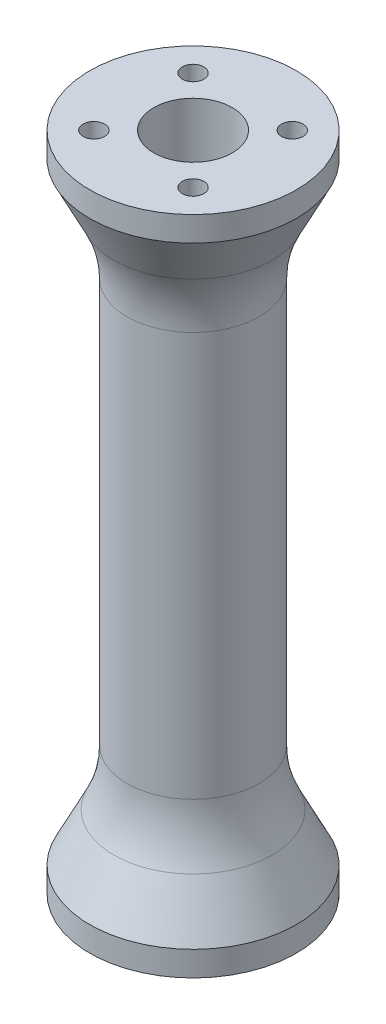
ISO-10303-21;
HEADER;
FILE_DESCRIPTION(('STEP AP214'),'2;1');
FILE_NAME('part.step','',(''),(''),'','','');
FILE_SCHEMA(('AUTOMOTIVE_DESIGN { 1 0 10303 214 1 1 1 1 }'));
ENDSEC;
DATA;
#1=APPLICATION_CONTEXT('core data for automotive mechanical design processes');
#2=APPLICATION_PROTOCOL_DEFINITION('international standard','automotive_design',2000,#1);
#3=PRODUCT_CONTEXT('',#1,'mechanical');
#4=PRODUCT('Part','Part','',(#3));
#5=PRODUCT_RELATED_PRODUCT_CATEGORY('part','',(#4));
#6=PRODUCT_DEFINITION_FORMATION('','',#4);
#7=PRODUCT_DEFINITION_CONTEXT('part definition',#1,'design');
#8=PRODUCT_DEFINITION('design','',#6,#7);
#9=PRODUCT_DEFINITION_SHAPE('','',#8);
#10=(LENGTH_UNIT() NAMED_UNIT(*) SI_UNIT(.MILLI.,.METRE.));
#11=(NAMED_UNIT(*) PLANE_ANGLE_UNIT() SI_UNIT($,.RADIAN.));
#12=(NAMED_UNIT(*) SI_UNIT($,.STERADIAN.) SOLID_ANGLE_UNIT());
#13=UNCERTAINTY_MEASURE_WITH_UNIT(LENGTH_MEASURE(1.E-05),#10,'distance_accuracy_value','');
#14=(GEOMETRIC_REPRESENTATION_CONTEXT(3) GLOBAL_UNCERTAINTY_ASSIGNED_CONTEXT((#13)) GLOBAL_UNIT_ASSIGNED_CONTEXT((#10,
#11,#12)) REPRESENTATION_CONTEXT('',''));
#15=CARTESIAN_POINT('',(0.,0.,0.));
#16=DIRECTION('',(0.,0.,1.));
#17=DIRECTION('',(1.,0.,0.));
#18=AXIS2_PLACEMENT_3D('',#15,#16,#17);
#19=CARTESIAN_POINT('',(0.,40.,0.));
#20=DIRECTION('',(0.,-1.,0.));
#21=DIRECTION('',(0.,0.,-1.));
#22=AXIS2_PLACEMENT_3D('',#19,#20,#21);
#23=PLANE('',#22);
#24=CARTESIAN_POINT('',(0.,40.,0.));
#25=DIRECTION('',(0.,1.,0.));
#26=DIRECTION('',(0.,0.,1.));
#27=AXIS2_PLACEMENT_3D('',#24,#25,#26);
#28=CIRCLE('',#27,4.75);
#29=CARTESIAN_POINT('',(0.,40.,4.75));
#30=VERTEX_POINT('',#29);
#31=EDGE_CURVE('E140',#30,#30,#28,.T.);
#32=ORIENTED_EDGE('',*,*,#31,.F.);
#33=EDGE_LOOP('',(#32));
#34=FACE_BOUND('',#33,.T.);
#35=CARTESIAN_POINT('',(6.,40.,-6.));
#36=DIRECTION('',(0.,1.,0.));
#37=DIRECTION('',(0.,0.,1.));
#38=AXIS2_PLACEMENT_3D('',#35,#36,#37);
#39=CIRCLE('',#38,1.3);
#40=CARTESIAN_POINT('',(6.,40.,-4.7));
#41=VERTEX_POINT('',#40);
#42=EDGE_CURVE('E94',#41,#41,#39,.T.);
#43=ORIENTED_EDGE('',*,*,#42,.F.);
#44=EDGE_LOOP('',(#43));
#45=FACE_BOUND('',#44,.T.);
#46=CARTESIAN_POINT('',(-6.,40.,6.));
#47=DIRECTION('',(0.,1.,0.));
#48=DIRECTION('',(0.,0.,1.));
#49=AXIS2_PLACEMENT_3D('',#46,#47,#48);
#50=CIRCLE('',#49,1.3);
#51=CARTESIAN_POINT('',(-6.,40.,7.3));
#52=VERTEX_POINT('',#51);
#53=EDGE_CURVE('E100',#52,#52,#50,.T.);
#54=ORIENTED_EDGE('',*,*,#53,.F.);
#55=EDGE_LOOP('',(#54));
#56=FACE_BOUND('',#55,.T.);
#57=CARTESIAN_POINT('',(6.,40.,6.));
#58=DIRECTION('',(0.,1.,0.));
#59=DIRECTION('',(0.,0.,1.));
#60=AXIS2_PLACEMENT_3D('',#57,#58,#59);
#61=CIRCLE('',#60,1.3);
#62=CARTESIAN_POINT('',(6.,40.,7.3));
#63=VERTEX_POINT('',#62);
#64=EDGE_CURVE('E101',#63,#63,#61,.T.);
#65=ORIENTED_EDGE('',*,*,#64,.F.);
#66=EDGE_LOOP('',(#65));
#67=FACE_BOUND('',#66,.T.);
#68=CARTESIAN_POINT('',(-6.,40.,-6.));
#69=DIRECTION('',(0.,1.,0.));
#70=DIRECTION('',(0.,0.,1.));
#71=AXIS2_PLACEMENT_3D('',#68,#69,#70);
#72=CIRCLE('',#71,1.3);
#73=CARTESIAN_POINT('',(-6.,40.,-4.7));
#74=VERTEX_POINT('',#73);
#75=EDGE_CURVE('E91',#74,#74,#72,.T.);
#76=ORIENTED_EDGE('',*,*,#75,.F.);
#77=EDGE_LOOP('',(#76));
#78=FACE_BOUND('',#77,.T.);
#79=CARTESIAN_POINT('',(0.,40.,0.));
#80=DIRECTION('',(0.,-1.,0.));
#81=DIRECTION('',(0.,0.,-1.));
#82=AXIS2_PLACEMENT_3D('',#79,#80,#81);
#83=CIRCLE('',#82,12.5);
#84=CARTESIAN_POINT('',(0.,40.,-12.5));
#85=VERTEX_POINT('',#84);
#86=EDGE_CURVE('E73',#85,#85,#83,.T.);
#87=ORIENTED_EDGE('',*,*,#86,.F.);
#88=EDGE_LOOP('',(#87));
#89=FACE_BOUND('',#88,.T.);
#90=ADVANCED_FACE('F41',(#34,#45,#56,#67,#78,#89),#23,.F.);
#91=CARTESIAN_POINT('',(0.,-40.,0.));
#92=DIRECTION('',(0.,-1.,0.));
#93=DIRECTION('',(0.,0.,-1.));
#94=AXIS2_PLACEMENT_3D('',#91,#92,#93);
#95=CYLINDRICAL_SURFACE('',#94,12.5);
#96=CARTESIAN_POINT('',(0.,37.,0.));
#97=DIRECTION('',(0.,-1.,0.));
#98=DIRECTION('',(0.,0.,-1.));
#99=AXIS2_PLACEMENT_3D('',#96,#97,#98);
#100=CIRCLE('',#99,12.5);
#101=CARTESIAN_POINT('',(0.,37.,-12.5));
#102=VERTEX_POINT('',#101);
#103=EDGE_CURVE('E81',#102,#102,#100,.T.);
#104=ORIENTED_EDGE('',*,*,#103,.F.);
#105=EDGE_LOOP('',(#104));
#106=FACE_BOUND('',#105,.T.);
#107=ORIENTED_EDGE('',*,*,#86,.T.);
#108=EDGE_LOOP('',(#107));
#109=FACE_BOUND('',#108,.T.);
#110=ADVANCED_FACE('F174',(#106,#109),#95,.T.);
#111=CARTESIAN_POINT('',(0.,37.,0.));
#112=DIRECTION('',(0.,1.,0.));
#113=DIRECTION('',(0.,0.,1.));
#114=AXIS2_PLACEMENT_3D('',#111,#112,#113);
#115=CONICAL_SURFACE('',#114,12.5,0.463647609000807);
#116=CARTESIAN_POINT('',(0.,31.1671842700025,0.));
#117=DIRECTION('',(0.,1.,0.));
#118=DIRECTION('',(0.,0.,1.));
#119=AXIS2_PLACEMENT_3D('',#116,#117,#118);
#120=CIRCLE('',#119,9.58359213500126);
#121=CARTESIAN_POINT('',(0.,31.1671842700025,9.58359213500126));
#122=VERTEX_POINT('',#121);
#123=EDGE_CURVE('E61',#122,#122,#120,.T.);
#124=ORIENTED_EDGE('',*,*,#123,.T.);
#125=EDGE_LOOP('',(#124));
#126=FACE_BOUND('',#125,.T.);
#127=ORIENTED_EDGE('',*,*,#103,.T.);
#128=EDGE_LOOP('',(#127));
#129=FACE_BOUND('',#128,.T.);
#130=ADVANCED_FACE('F182',(#126,#129),#115,.T.);
#131=CARTESIAN_POINT('',(0.,-40.,0.));
#132=DIRECTION('',(0.,-1.,0.));
#133=DIRECTION('',(0.,0.,-1.));
#134=AXIS2_PLACEMENT_3D('',#131,#132,#133);
#135=CYLINDRICAL_SURFACE('',#134,7.99999999999999);
#136=CARTESIAN_POINT('',(0.,-24.4589803375031,0.));
#137=DIRECTION('',(0.,-1.,0.));
#138=DIRECTION('',(0.,0.,-1.));
#139=AXIS2_PLACEMENT_3D('',#136,#137,#138);
#140=CIRCLE('',#139,7.99999999999999);
#141=CARTESIAN_POINT('',(0.,-24.4589803375031,-7.99999999999999));
#142=VERTEX_POINT('',#141);
#143=EDGE_CURVE('E64',#142,#142,#140,.F.);
#144=ORIENTED_EDGE('',*,*,#143,.T.);
#145=EDGE_LOOP('',(#144));
#146=FACE_BOUND('',#145,.T.);
#147=CARTESIAN_POINT('',(0.,24.4589803375031,0.));
#148=DIRECTION('',(0.,-1.,0.));
#149=DIRECTION('',(0.,0.,-1.));
#150=AXIS2_PLACEMENT_3D('',#147,#148,#149);
#151=CIRCLE('',#150,7.99999999999999);
#152=CARTESIAN_POINT('',(0.,24.4589803375031,-7.99999999999999));
#153=VERTEX_POINT('',#152);
#154=EDGE_CURVE('E67',#153,#153,#151,.T.);
#155=ORIENTED_EDGE('',*,*,#154,.T.);
#156=EDGE_LOOP('',(#155));
#157=FACE_BOUND('',#156,.T.);
#158=ADVANCED_FACE('F281',(#146,#157),#135,.T.);
#159=CARTESIAN_POINT('',(0.,-28.,0.));
#160=DIRECTION('',(0.,-1.,0.));
#161=DIRECTION('',(0.,0.,-1.));
#162=AXIS2_PLACEMENT_3D('',#159,#160,#161);
#163=CONICAL_SURFACE('',#162,7.99999999999999,0.463647609000807);
#164=CARTESIAN_POINT('',(0.,-31.1671842700025,0.));
#165=DIRECTION('',(0.,-1.,0.));
#166=DIRECTION('',(0.,0.,-1.));
#167=AXIS2_PLACEMENT_3D('',#164,#165,#166);
#168=CIRCLE('',#167,9.58359213500126);
#169=CARTESIAN_POINT('',(0.,-31.1671842700025,-9.58359213500126));
#170=VERTEX_POINT('',#169);
#171=EDGE_CURVE('E70',#170,#170,#168,.T.);
#172=ORIENTED_EDGE('',*,*,#171,.T.);
#173=EDGE_LOOP('',(#172));
#174=FACE_BOUND('',#173,.T.);
#175=CARTESIAN_POINT('',(0.,-37.,0.));
#176=DIRECTION('',(0.,-1.,0.));
#177=DIRECTION('',(0.,0.,-1.));
#178=AXIS2_PLACEMENT_3D('',#175,#176,#177);
#179=CIRCLE('',#178,12.5);
#180=CARTESIAN_POINT('',(0.,-37.,-12.5));
#181=VERTEX_POINT('',#180);
#182=EDGE_CURVE('E84',#181,#181,#179,.T.);
#183=ORIENTED_EDGE('',*,*,#182,.F.);
#184=EDGE_LOOP('',(#183));
#185=FACE_BOUND('',#184,.T.);
#186=ADVANCED_FACE('F277',(#174,#185),#163,.T.);
#187=CARTESIAN_POINT('',(0.,-40.,0.));
#188=DIRECTION('',(0.,-1.,0.));
#189=DIRECTION('',(0.,0.,-1.));
#190=AXIS2_PLACEMENT_3D('',#187,#188,#189);
#191=CYLINDRICAL_SURFACE('',#190,12.5);
#192=CARTESIAN_POINT('',(0.,-40.,0.));
#193=DIRECTION('',(0.,-1.,0.));
#194=DIRECTION('',(0.,0.,-1.));
#195=AXIS2_PLACEMENT_3D('',#192,#193,#194);
#196=CIRCLE('',#195,12.5);
#197=CARTESIAN_POINT('',(0.,-40.,-12.5));
#198=VERTEX_POINT('',#197);
#199=EDGE_CURVE('E87',#198,#198,#196,.T.);
#200=ORIENTED_EDGE('',*,*,#199,.F.);
#201=EDGE_LOOP('',(#200));
#202=FACE_BOUND('',#201,.T.);
#203=ORIENTED_EDGE('',*,*,#182,.T.);
#204=EDGE_LOOP('',(#203));
#205=FACE_BOUND('',#204,.T.);
#206=ADVANCED_FACE('F274',(#202,#205),#191,.T.);
#207=CARTESIAN_POINT('',(0.,-40.,0.));
#208=DIRECTION('',(0.,1.,0.));
#209=DIRECTION('',(0.,0.,1.));
#210=AXIS2_PLACEMENT_3D('',#207,#208,#209);
#211=PLANE('',#210);
#212=CARTESIAN_POINT('',(0.,-40.,0.));
#213=DIRECTION('',(0.,1.,0.));
#214=DIRECTION('',(0.,0.,1.));
#215=AXIS2_PLACEMENT_3D('',#212,#213,#214);
#216=CIRCLE('',#215,4.75);
#217=CARTESIAN_POINT('',(0.,-40.,4.75));
#218=VERTEX_POINT('',#217);
#219=EDGE_CURVE('E78',#218,#218,#216,.T.);
#220=ORIENTED_EDGE('',*,*,#219,.T.);
#221=EDGE_LOOP('',(#220));
#222=FACE_BOUND('',#221,.T.);
#223=CARTESIAN_POINT('',(6.,-40.,-6.));
#224=DIRECTION('',(0.,1.,0.));
#225=DIRECTION('',(0.,0.,1.));
#226=AXIS2_PLACEMENT_3D('',#223,#224,#225);
#227=CIRCLE('',#226,1.3);
#228=CARTESIAN_POINT('',(6.,-40.,-4.7));
#229=VERTEX_POINT('',#228);
#230=EDGE_CURVE('E128',#229,#229,#227,.T.);
#231=ORIENTED_EDGE('',*,*,#230,.T.);
#232=EDGE_LOOP('',(#231));
#233=FACE_BOUND('',#232,.T.);
#234=CARTESIAN_POINT('',(-6.,-40.,6.));
#235=DIRECTION('',(0.,1.,0.));
#236=DIRECTION('',(0.,0.,1.));
#237=AXIS2_PLACEMENT_3D('',#234,#235,#236);
#238=CIRCLE('',#237,1.3);
#239=CARTESIAN_POINT('',(-6.,-40.,7.3));
#240=VERTEX_POINT('',#239);
#241=EDGE_CURVE('E121',#240,#240,#238,.T.);
#242=ORIENTED_EDGE('',*,*,#241,.T.);
#243=EDGE_LOOP('',(#242));
#244=FACE_BOUND('',#243,.T.);
#245=CARTESIAN_POINT('',(6.,-40.,6.));
#246=DIRECTION('',(0.,1.,0.));
#247=DIRECTION('',(0.,0.,1.));
#248=AXIS2_PLACEMENT_3D('',#245,#246,#247);
#249=CIRCLE('',#248,1.3);
#250=CARTESIAN_POINT('',(6.,-40.,7.3));
#251=VERTEX_POINT('',#250);
#252=EDGE_CURVE('E133',#251,#251,#249,.T.);
#253=ORIENTED_EDGE('',*,*,#252,.T.);
#254=EDGE_LOOP('',(#253));
#255=FACE_BOUND('',#254,.T.);
#256=CARTESIAN_POINT('',(-6.,-40.,-6.));
#257=DIRECTION('',(0.,1.,0.));
#258=DIRECTION('',(0.,0.,1.));
#259=AXIS2_PLACEMENT_3D('',#256,#257,#258);
#260=CIRCLE('',#259,1.3);
#261=CARTESIAN_POINT('',(-6.,-40.,-4.7));
#262=VERTEX_POINT('',#261);
#263=EDGE_CURVE('E115',#262,#262,#260,.T.);
#264=ORIENTED_EDGE('',*,*,#263,.T.);
#265=EDGE_LOOP('',(#264));
#266=FACE_BOUND('',#265,.T.);
#267=ORIENTED_EDGE('',*,*,#199,.T.);
#268=EDGE_LOOP('',(#267));
#269=FACE_BOUND('',#268,.T.);
#270=ADVANCED_FACE('F146',(#222,#233,#244,#255,#266,#269),#211,.F.);
#271=CARTESIAN_POINT('',(-6.,33.,-6.));
#272=DIRECTION('',(0.,1.,0.));
#273=DIRECTION('',(0.,0.,1.));
#274=AXIS2_PLACEMENT_3D('',#271,#272,#273);
#275=CYLINDRICAL_SURFACE('',#274,1.3);
#276=CARTESIAN_POINT('',(-6.,33.,-6.));
#277=DIRECTION('',(0.,1.,0.));
#278=DIRECTION('',(0.,0.,1.));
#279=AXIS2_PLACEMENT_3D('',#276,#277,#278);
#280=CIRCLE('',#279,1.3);
#281=CARTESIAN_POINT('',(-6.,33.,-4.7));
#282=VERTEX_POINT('',#281);
#283=EDGE_CURVE('E90',#282,#282,#280,.T.);
#284=ORIENTED_EDGE('',*,*,#283,.F.);
#285=EDGE_LOOP('',(#284));
#286=FACE_BOUND('',#285,.T.);
#287=ORIENTED_EDGE('',*,*,#75,.T.);
#288=EDGE_LOOP('',(#287));
#289=FACE_BOUND('',#288,.T.);
#290=ADVANCED_FACE('F268',(#286,#289),#275,.F.);
#291=CARTESIAN_POINT('',(-6.,33.,-6.));
#292=DIRECTION('',(0.,1.,0.));
#293=DIRECTION('',(0.,0.,1.));
#294=AXIS2_PLACEMENT_3D('',#291,#292,#293);
#295=PLANE('',#294);
#296=ORIENTED_EDGE('',*,*,#283,.T.);
#297=EDGE_LOOP('',(#296));
#298=FACE_BOUND('',#297,.T.);
#299=ADVANCED_FACE('F246',(#298),#295,.T.);
#300=CARTESIAN_POINT('',(6.,33.,6.));
#301=DIRECTION('',(0.,1.,0.));
#302=DIRECTION('',(0.,0.,1.));
#303=AXIS2_PLACEMENT_3D('',#300,#301,#302);
#304=CYLINDRICAL_SURFACE('',#303,1.3);
#305=CARTESIAN_POINT('',(6.,33.,6.));
#306=DIRECTION('',(0.,1.,0.));
#307=DIRECTION('',(0.,0.,1.));
#308=AXIS2_PLACEMENT_3D('',#305,#306,#307);
#309=CIRCLE('',#308,1.3);
#310=CARTESIAN_POINT('',(6.,33.,7.3));
#311=VERTEX_POINT('',#310);
#312=EDGE_CURVE('E109',#311,#311,#309,.T.);
#313=ORIENTED_EDGE('',*,*,#312,.F.);
#314=EDGE_LOOP('',(#313));
#315=FACE_BOUND('',#314,.T.);
#316=ORIENTED_EDGE('',*,*,#64,.T.);
#317=EDGE_LOOP('',(#316));
#318=FACE_BOUND('',#317,.T.);
#319=ADVANCED_FACE('F242',(#315,#318),#304,.F.);
#320=CARTESIAN_POINT('',(6.,33.,6.));
#321=DIRECTION('',(0.,1.,0.));
#322=DIRECTION('',(0.,0.,1.));
#323=AXIS2_PLACEMENT_3D('',#320,#321,#322);
#324=PLANE('',#323);
#325=ORIENTED_EDGE('',*,*,#312,.T.);
#326=EDGE_LOOP('',(#325));
#327=FACE_BOUND('',#326,.T.);
#328=ADVANCED_FACE('F245',(#327),#324,.T.);
#329=CARTESIAN_POINT('',(-6.,33.,6.));
#330=DIRECTION('',(0.,1.,0.));
#331=DIRECTION('',(0.,0.,1.));
#332=AXIS2_PLACEMENT_3D('',#329,#330,#331);
#333=CYLINDRICAL_SURFACE('',#332,1.3);
#334=CARTESIAN_POINT('',(-6.,33.,6.));
#335=DIRECTION('',(0.,1.,0.));
#336=DIRECTION('',(0.,0.,1.));
#337=AXIS2_PLACEMENT_3D('',#334,#335,#336);
#338=CIRCLE('',#337,1.3);
#339=CARTESIAN_POINT('',(-6.,33.,7.3));
#340=VERTEX_POINT('',#339);
#341=EDGE_CURVE('E97',#340,#340,#338,.T.);
#342=ORIENTED_EDGE('',*,*,#341,.F.);
#343=EDGE_LOOP('',(#342));
#344=FACE_BOUND('',#343,.T.);
#345=ORIENTED_EDGE('',*,*,#53,.T.);
#346=EDGE_LOOP('',(#345));
#347=FACE_BOUND('',#346,.T.);
#348=ADVANCED_FACE('F250',(#344,#347),#333,.F.);
#349=CARTESIAN_POINT('',(-6.,33.,6.));
#350=DIRECTION('',(0.,1.,0.));
#351=DIRECTION('',(0.,0.,1.));
#352=AXIS2_PLACEMENT_3D('',#349,#350,#351);
#353=PLANE('',#352);
#354=ORIENTED_EDGE('',*,*,#341,.T.);
#355=EDGE_LOOP('',(#354));
#356=FACE_BOUND('',#355,.T.);
#357=ADVANCED_FACE('F255',(#356),#353,.T.);
#358=CARTESIAN_POINT('',(6.,33.,-6.));
#359=DIRECTION('',(0.,1.,0.));
#360=DIRECTION('',(0.,0.,1.));
#361=AXIS2_PLACEMENT_3D('',#358,#359,#360);
#362=CYLINDRICAL_SURFACE('',#361,1.3);
#363=CARTESIAN_POINT('',(6.,33.,-6.));
#364=DIRECTION('',(0.,1.,0.));
#365=DIRECTION('',(0.,0.,1.));
#366=AXIS2_PLACEMENT_3D('',#363,#364,#365);
#367=CIRCLE('',#366,1.3);
#368=CARTESIAN_POINT('',(6.,33.,-4.7));
#369=VERTEX_POINT('',#368);
#370=EDGE_CURVE('E104',#369,#369,#367,.T.);
#371=ORIENTED_EDGE('',*,*,#370,.F.);
#372=EDGE_LOOP('',(#371));
#373=FACE_BOUND('',#372,.T.);
#374=ORIENTED_EDGE('',*,*,#42,.T.);
#375=EDGE_LOOP('',(#374));
#376=FACE_BOUND('',#375,.T.);
#377=ADVANCED_FACE('F252',(#373,#376),#362,.F.);
#378=CARTESIAN_POINT('',(6.,33.,-6.));
#379=DIRECTION('',(0.,1.,0.));
#380=DIRECTION('',(0.,0.,1.));
#381=AXIS2_PLACEMENT_3D('',#378,#379,#380);
#382=PLANE('',#381);
#383=ORIENTED_EDGE('',*,*,#370,.T.);
#384=EDGE_LOOP('',(#383));
#385=FACE_BOUND('',#384,.T.);
#386=ADVANCED_FACE('F240',(#385),#382,.T.);
#387=CARTESIAN_POINT('',(-6.,-33.,-6.));
#388=DIRECTION('',(0.,-1.,0.));
#389=DIRECTION('',(0.,0.,-1.));
#390=AXIS2_PLACEMENT_3D('',#387,#388,#389);
#391=CYLINDRICAL_SURFACE('',#390,1.3);
#392=CARTESIAN_POINT('',(-6.,-33.,-6.));
#393=DIRECTION('',(0.,1.,0.));
#394=DIRECTION('',(0.,0.,1.));
#395=AXIS2_PLACEMENT_3D('',#392,#393,#394);
#396=CIRCLE('',#395,1.3);
#397=CARTESIAN_POINT('',(-6.,-33.,-4.7));
#398=VERTEX_POINT('',#397);
#399=EDGE_CURVE('E112',#398,#398,#396,.T.);
#400=ORIENTED_EDGE('',*,*,#399,.T.);
#401=EDGE_LOOP('',(#400));
#402=FACE_BOUND('',#401,.T.);
#403=ORIENTED_EDGE('',*,*,#263,.F.);
#404=EDGE_LOOP('',(#403));
#405=FACE_BOUND('',#404,.T.);
#406=ADVANCED_FACE('F236',(#402,#405),#391,.F.);
#407=CARTESIAN_POINT('',(-6.,-33.,-6.));
#408=DIRECTION('',(0.,-1.,0.));
#409=DIRECTION('',(0.,0.,1.));
#410=AXIS2_PLACEMENT_3D('',#407,#408,#409);
#411=PLANE('',#410);
#412=ORIENTED_EDGE('',*,*,#399,.F.);
#413=EDGE_LOOP('',(#412));
#414=FACE_BOUND('',#413,.T.);
#415=ADVANCED_FACE('F219',(#414),#411,.T.);
#416=CARTESIAN_POINT('',(6.,-33.,6.));
#417=DIRECTION('',(0.,-1.,0.));
#418=DIRECTION('',(0.,0.,-1.));
#419=AXIS2_PLACEMENT_3D('',#416,#417,#418);
#420=CYLINDRICAL_SURFACE('',#419,1.3);
#421=CARTESIAN_POINT('',(6.,-33.,6.));
#422=DIRECTION('',(0.,1.,0.));
#423=DIRECTION('',(0.,0.,1.));
#424=AXIS2_PLACEMENT_3D('',#421,#422,#423);
#425=CIRCLE('',#424,1.3);
#426=CARTESIAN_POINT('',(6.,-33.,7.3));
#427=VERTEX_POINT('',#426);
#428=EDGE_CURVE('E125',#427,#427,#425,.T.);
#429=ORIENTED_EDGE('',*,*,#428,.T.);
#430=EDGE_LOOP('',(#429));
#431=FACE_BOUND('',#430,.T.);
#432=ORIENTED_EDGE('',*,*,#252,.F.);
#433=EDGE_LOOP('',(#432));
#434=FACE_BOUND('',#433,.T.);
#435=ADVANCED_FACE('F215',(#431,#434),#420,.F.);
#436=CARTESIAN_POINT('',(6.,-33.,6.));
#437=DIRECTION('',(0.,-1.,0.));
#438=DIRECTION('',(0.,0.,1.));
#439=AXIS2_PLACEMENT_3D('',#436,#437,#438);
#440=PLANE('',#439);
#441=ORIENTED_EDGE('',*,*,#428,.F.);
#442=EDGE_LOOP('',(#441));
#443=FACE_BOUND('',#442,.T.);
#444=ADVANCED_FACE('F211',(#443),#440,.T.);
#445=CARTESIAN_POINT('',(-6.,-33.,6.));
#446=DIRECTION('',(0.,-1.,0.));
#447=DIRECTION('',(0.,0.,-1.));
#448=AXIS2_PLACEMENT_3D('',#445,#446,#447);
#449=CYLINDRICAL_SURFACE('',#448,1.3);
#450=CARTESIAN_POINT('',(-6.,-33.,6.));
#451=DIRECTION('',(0.,1.,0.));
#452=DIRECTION('',(0.,0.,1.));
#453=AXIS2_PLACEMENT_3D('',#450,#451,#452);
#454=CIRCLE('',#453,1.3);
#455=CARTESIAN_POINT('',(-6.,-33.,7.3));
#456=VERTEX_POINT('',#455);
#457=EDGE_CURVE('E124',#456,#456,#454,.T.);
#458=ORIENTED_EDGE('',*,*,#457,.T.);
#459=EDGE_LOOP('',(#458));
#460=FACE_BOUND('',#459,.T.);
#461=ORIENTED_EDGE('',*,*,#241,.F.);
#462=EDGE_LOOP('',(#461));
#463=FACE_BOUND('',#462,.T.);
#464=ADVANCED_FACE('F214',(#460,#463),#449,.F.);
#465=CARTESIAN_POINT('',(-6.,-33.,6.));
#466=DIRECTION('',(0.,-1.,0.));
#467=DIRECTION('',(0.,0.,1.));
#468=AXIS2_PLACEMENT_3D('',#465,#466,#467);
#469=PLANE('',#468);
#470=ORIENTED_EDGE('',*,*,#457,.F.);
#471=EDGE_LOOP('',(#470));
#472=FACE_BOUND('',#471,.T.);
#473=ADVANCED_FACE('F226',(#472),#469,.T.);
#474=CARTESIAN_POINT('',(6.,-33.,-6.));
#475=DIRECTION('',(0.,-1.,0.));
#476=DIRECTION('',(0.,0.,-1.));
#477=AXIS2_PLACEMENT_3D('',#474,#475,#476);
#478=CYLINDRICAL_SURFACE('',#477,1.3);
#479=CARTESIAN_POINT('',(6.,-33.,-6.));
#480=DIRECTION('',(0.,1.,0.));
#481=DIRECTION('',(0.,0.,1.));
#482=AXIS2_PLACEMENT_3D('',#479,#480,#481);
#483=CIRCLE('',#482,1.3);
#484=CARTESIAN_POINT('',(6.,-33.,-4.7));
#485=VERTEX_POINT('',#484);
#486=EDGE_CURVE('E118',#485,#485,#483,.T.);
#487=ORIENTED_EDGE('',*,*,#486,.T.);
#488=EDGE_LOOP('',(#487));
#489=FACE_BOUND('',#488,.T.);
#490=ORIENTED_EDGE('',*,*,#230,.F.);
#491=EDGE_LOOP('',(#490));
#492=FACE_BOUND('',#491,.T.);
#493=ADVANCED_FACE('F222',(#489,#492),#478,.F.);
#494=CARTESIAN_POINT('',(6.,-33.,-6.));
#495=DIRECTION('',(0.,-1.,0.));
#496=DIRECTION('',(0.,0.,1.));
#497=AXIS2_PLACEMENT_3D('',#494,#495,#496);
#498=PLANE('',#497);
#499=ORIENTED_EDGE('',*,*,#486,.F.);
#500=EDGE_LOOP('',(#499));
#501=FACE_BOUND('',#500,.T.);
#502=ADVANCED_FACE('F153',(#501),#498,.T.);
#503=CARTESIAN_POINT('',(0.,-40.,0.));
#504=DIRECTION('',(0.,1.,0.));
#505=DIRECTION('',(0.,0.,1.));
#506=AXIS2_PLACEMENT_3D('',#503,#504,#505);
#507=CYLINDRICAL_SURFACE('',#506,4.75);
#508=ORIENTED_EDGE('',*,*,#219,.F.);
#509=EDGE_LOOP('',(#508));
#510=FACE_BOUND('',#509,.T.);
#511=CARTESIAN_POINT('',(0.,-31.95,0.));
#512=DIRECTION('',(0.,1.,0.));
#513=DIRECTION('',(0.,0.,1.));
#514=AXIS2_PLACEMENT_3D('',#511,#512,#513);
#515=CIRCLE('',#514,4.75);
#516=CARTESIAN_POINT('',(0.,-31.95,4.74999999999999));
#517=VERTEX_POINT('',#516);
#518=EDGE_CURVE('E74',#517,#517,#515,.F.);
#519=ORIENTED_EDGE('',*,*,#518,.F.);
#520=EDGE_LOOP('',(#519));
#521=FACE_BOUND('',#520,.T.);
#522=ADVANCED_FACE('F149',(#510,#521),#507,.F.);
#523=ORIENTED_EDGE('',*,*,#31,.T.);
#524=EDGE_LOOP('',(#523));
#525=FACE_BOUND('',#524,.T.);
#526=CARTESIAN_POINT('',(0.,31.95,0.));
#527=DIRECTION('',(0.,-1.,0.));
#528=DIRECTION('',(0.,0.,-1.));
#529=AXIS2_PLACEMENT_3D('',#526,#527,#528);
#530=CIRCLE('',#529,4.75);
#531=CARTESIAN_POINT('',(0.,31.95,-4.75));
#532=VERTEX_POINT('',#531);
#533=EDGE_CURVE('E77',#532,#532,#530,.F.);
#534=ORIENTED_EDGE('',*,*,#533,.F.);
#535=EDGE_LOOP('',(#534));
#536=FACE_BOUND('',#535,.T.);
#537=ADVANCED_FACE('F152',(#525,#536),#507,.F.);
#538=CARTESIAN_POINT('',(0.,36.6999999999999,0.));
#539=DIRECTION('',(0.,1.,0.));
#540=DIRECTION('',(0.,0.,1.));
#541=AXIS2_PLACEMENT_3D('',#538,#539,#540);
#542=CYLINDRICAL_SURFACE('',#541,7.);
#543=CARTESIAN_POINT('',(0.,-28.0431457505076,0.));
#544=DIRECTION('',(0.,1.,0.));
#545=DIRECTION('',(0.,0.,1.));
#546=AXIS2_PLACEMENT_3D('',#543,#544,#545);
#547=CIRCLE('',#546,7.);
#548=CARTESIAN_POINT('',(0.,-28.0431457505076,6.99999999999999));
#549=VERTEX_POINT('',#548);
#550=EDGE_CURVE('E48',#549,#549,#547,.F.);
#551=ORIENTED_EDGE('',*,*,#550,.T.);
#552=EDGE_LOOP('',(#551));
#553=FACE_BOUND('',#552,.T.);
#554=CARTESIAN_POINT('',(0.,28.0431457505076,0.));
#555=DIRECTION('',(0.,1.,0.));
#556=DIRECTION('',(0.,0.,1.));
#557=AXIS2_PLACEMENT_3D('',#554,#555,#556);
#558=CIRCLE('',#557,7.);
#559=CARTESIAN_POINT('',(0.,28.0431457505076,7.));
#560=VERTEX_POINT('',#559);
#561=EDGE_CURVE('E52',#560,#560,#558,.T.);
#562=ORIENTED_EDGE('',*,*,#561,.T.);
#563=EDGE_LOOP('',(#562));
#564=FACE_BOUND('',#563,.T.);
#565=ADVANCED_FACE('F171',(#553,#564),#542,.F.);
#566=CARTESIAN_POINT('',(0.,36.6999999999999,0.));
#567=DIRECTION('',(0.,-1.,0.));
#568=DIRECTION('',(0.,0.,-1.));
#569=AXIS2_PLACEMENT_3D('',#566,#567,#568);
#570=CONICAL_SURFACE('',#569,0.,0.785398163397454);
#571=CARTESIAN_POINT('',(0.,30.8715728752538,0.));
#572=DIRECTION('',(0.,-1.,0.));
#573=DIRECTION('',(0.,0.,-1.));
#574=AXIS2_PLACEMENT_3D('',#571,#572,#573);
#575=CIRCLE('',#574,5.82842712474618);
#576=CARTESIAN_POINT('',(0.,30.8715728752538,-5.82842712474618));
#577=VERTEX_POINT('',#576);
#578=EDGE_CURVE('E10',#577,#577,#575,.T.);
#579=ORIENTED_EDGE('',*,*,#578,.T.);
#580=EDGE_LOOP('',(#579));
#581=FACE_BOUND('',#580,.T.);
#582=ORIENTED_EDGE('',*,*,#533,.T.);
#583=EDGE_LOOP('',(#582));
#584=FACE_BOUND('',#583,.T.);
#585=ADVANCED_FACE('F160',(#581,#584),#570,.F.);
#586=CARTESIAN_POINT('',(0.,-29.7,0.));
#587=DIRECTION('',(0.,1.,0.));
#588=DIRECTION('',(0.,0.,1.));
#589=AXIS2_PLACEMENT_3D('',#586,#587,#588);
#590=CONICAL_SURFACE('',#589,7.,0.785398163397454);
#591=CARTESIAN_POINT('',(0.,-30.8715728752538,0.));
#592=DIRECTION('',(0.,1.,0.));
#593=DIRECTION('',(0.,0.,1.));
#594=AXIS2_PLACEMENT_3D('',#591,#592,#593);
#595=CIRCLE('',#594,5.82842712474617);
#596=CARTESIAN_POINT('',(0.,-30.8715728752538,5.82842712474616));
#597=VERTEX_POINT('',#596);
#598=EDGE_CURVE('E56',#597,#597,#595,.T.);
#599=ORIENTED_EDGE('',*,*,#598,.T.);
#600=EDGE_LOOP('',(#599));
#601=FACE_BOUND('',#600,.T.);
#602=ORIENTED_EDGE('',*,*,#518,.T.);
#603=EDGE_LOOP('',(#602));
#604=FACE_BOUND('',#603,.T.);
#605=ADVANCED_FACE('F157',(#601,#604),#590,.F.);
#606=CARTESIAN_POINT('',(0.,-24.4589803375031,0.));
#607=DIRECTION('',(0.,-1.,0.));
#608=DIRECTION('',(0.,0.,-1.));
#609=AXIS2_PLACEMENT_3D('',#606,#607,#608);
#610=TOROIDAL_SURFACE('',#609,23.,15.);
#611=ORIENTED_EDGE('',*,*,#143,.F.);
#612=EDGE_LOOP('',(#611));
#613=FACE_BOUND('',#612,.T.);
#614=ORIENTED_EDGE('',*,*,#171,.F.);
#615=EDGE_LOOP('',(#614));
#616=FACE_BOUND('',#615,.T.);
#617=ADVANCED_FACE('F159',(#613,#616),#610,.F.);
#618=CARTESIAN_POINT('',(0.,24.4589803375031,0.));
#619=DIRECTION('',(0.,-1.,0.));
#620=DIRECTION('',(0.,0.,-1.));
#621=AXIS2_PLACEMENT_3D('',#618,#619,#620);
#622=TOROIDAL_SURFACE('',#621,23.,15.);
#623=ORIENTED_EDGE('',*,*,#123,.F.);
#624=EDGE_LOOP('',(#623));
#625=FACE_BOUND('',#624,.T.);
#626=ORIENTED_EDGE('',*,*,#154,.F.);
#627=EDGE_LOOP('',(#626));
#628=FACE_BOUND('',#627,.T.);
#629=ADVANCED_FACE('F168',(#625,#628),#622,.F.);
#630=CARTESIAN_POINT('',(0.,-28.0431457505076,0.));
#631=DIRECTION('',(0.,1.,0.));
#632=DIRECTION('',(0.,0.,1.));
#633=AXIS2_PLACEMENT_3D('',#630,#631,#632);
#634=DEGENERATE_TOROIDAL_SURFACE('',#633,3.,4.,.T.);
#635=ORIENTED_EDGE('',*,*,#550,.F.);
#636=EDGE_LOOP('',(#635));
#637=FACE_BOUND('',#636,.T.);
#638=ORIENTED_EDGE('',*,*,#598,.F.);
#639=EDGE_LOOP('',(#638));
#640=FACE_BOUND('',#639,.T.);
#641=ADVANCED_FACE('F190',(#637,#640),#634,.F.);
#642=CARTESIAN_POINT('',(0.,28.0431457505076,0.));
#643=DIRECTION('',(0.,1.,0.));
#644=DIRECTION('',(0.,0.,1.));
#645=AXIS2_PLACEMENT_3D('',#642,#643,#644);
#646=DEGENERATE_TOROIDAL_SURFACE('',#645,3.,4.,.T.);
#647=ORIENTED_EDGE('',*,*,#578,.F.);
#648=EDGE_LOOP('',(#647));
#649=FACE_BOUND('',#648,.T.);
#650=ORIENTED_EDGE('',*,*,#561,.F.);
#651=EDGE_LOOP('',(#650));
#652=FACE_BOUND('',#651,.T.);
#653=ADVANCED_FACE('F43',(#649,#652),#646,.F.);
#654=CLOSED_SHELL('',(#90,#110,#130,#158,#186,#206,#270,#290,#299,#319,#328,#348,#357,#377,#386,
#406,#415,#435,#444,#464,#473,#493,#502,#522,#537,#565,#585,#605,#617,#629,#641,#653));
#655=MANIFOLD_SOLID_BREP('B2',#654);
#656=ADVANCED_BREP_SHAPE_REPRESENTATION('',(#18,#655),#14);
#657=SHAPE_DEFINITION_REPRESENTATION(#9,#656);
ENDSEC;
END-ISO-10303-21;
